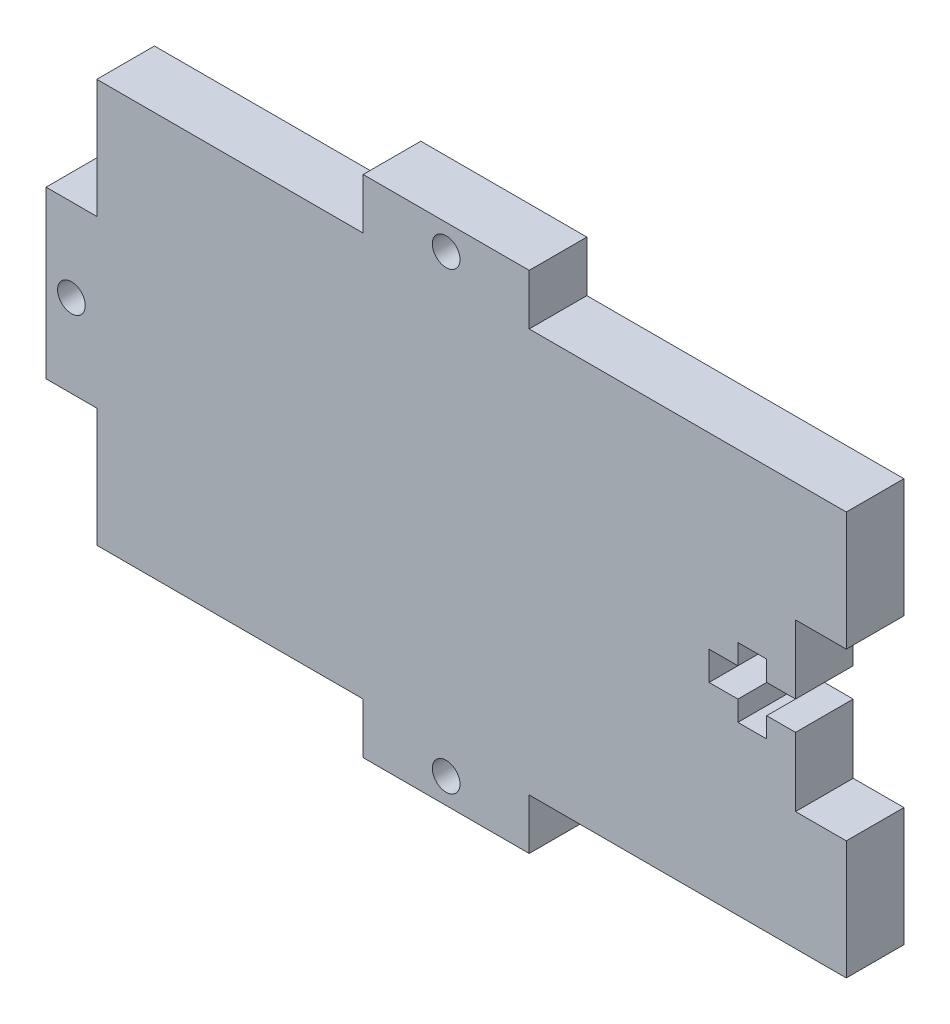
ISO-10303-21;
HEADER;
FILE_DESCRIPTION(('STEP AP214'),'2;1');
FILE_NAME('part.step','',(''),(''),'','','');
FILE_SCHEMA(('AUTOMOTIVE_DESIGN { 1 0 10303 214 1 1 1 1 }'));
ENDSEC;
DATA;
#1=APPLICATION_CONTEXT('core data for automotive mechanical design processes');
#2=APPLICATION_PROTOCOL_DEFINITION('international standard','automotive_design',2000,#1);
#3=PRODUCT_CONTEXT('',#1,'mechanical');
#4=PRODUCT('Part','Part','',(#3));
#5=PRODUCT_RELATED_PRODUCT_CATEGORY('part','',(#4));
#6=PRODUCT_DEFINITION_FORMATION('','',#4);
#7=PRODUCT_DEFINITION_CONTEXT('part definition',#1,'design');
#8=PRODUCT_DEFINITION('design','',#6,#7);
#9=PRODUCT_DEFINITION_SHAPE('','',#8);
#10=(LENGTH_UNIT() NAMED_UNIT(*) SI_UNIT(.MILLI.,.METRE.));
#11=(NAMED_UNIT(*) PLANE_ANGLE_UNIT() SI_UNIT($,.RADIAN.));
#12=(NAMED_UNIT(*) SI_UNIT($,.STERADIAN.) SOLID_ANGLE_UNIT());
#13=UNCERTAINTY_MEASURE_WITH_UNIT(LENGTH_MEASURE(1.E-05),#10,'distance_accuracy_value','');
#14=(GEOMETRIC_REPRESENTATION_CONTEXT(3) GLOBAL_UNCERTAINTY_ASSIGNED_CONTEXT((#13)) GLOBAL_UNIT_ASSIGNED_CONTEXT((#10,
#11,#12)) REPRESENTATION_CONTEXT('',''));
#15=CARTESIAN_POINT('',(0.,0.,0.));
#16=DIRECTION('',(0.,0.,1.));
#17=DIRECTION('',(1.,0.,0.));
#18=AXIS2_PLACEMENT_3D('',#15,#16,#17);
#19=CARTESIAN_POINT('',(76.962,13.081,-4.99999999997031E-05));
#20=DIRECTION('',(-1.,0.,0.));
#21=DIRECTION('',(0.,0.,1.));
#22=AXIS2_PLACEMENT_3D('',#19,#20,#21);
#23=PLANE('',#22);
#24=DIRECTION('',(0.,1.,0.));
#25=VECTOR('',#24,1.);
#26=CARTESIAN_POINT('',(76.962,0.,0.));
#27=LINE('',#26,#25);
#28=CARTESIAN_POINT('',(76.962,13.081,0.));
#29=VERTEX_POINT('',#28);
#30=CARTESIAN_POINT('',(76.962,20.6375,0.));
#31=VERTEX_POINT('',#30);
#32=EDGE_CURVE('E262',#29,#31,#27,.T.);
#33=ORIENTED_EDGE('',*,*,#32,.T.);
#34=DIRECTION('',(0.,0.,1.));
#35=VECTOR('',#34,1.);
#36=CARTESIAN_POINT('',(76.962,20.6375,-4.99999999997031E-05));
#37=LINE('',#36,#35);
#38=CARTESIAN_POINT('',(76.962,20.6375,6.35));
#39=VERTEX_POINT('',#38);
#40=EDGE_CURVE('E245',#31,#39,#37,.T.);
#41=ORIENTED_EDGE('',*,*,#40,.T.);
#42=DIRECTION('',(0.,-1.,0.));
#43=VECTOR('',#42,1.);
#44=CARTESIAN_POINT('',(76.962,13.081,6.35));
#45=LINE('',#44,#43);
#46=CARTESIAN_POINT('',(76.962,13.081,6.35));
#47=VERTEX_POINT('',#46);
#48=EDGE_CURVE('E259',#39,#47,#45,.T.);
#49=ORIENTED_EDGE('',*,*,#48,.T.);
#50=DIRECTION('',(0.,0.,1.));
#51=VECTOR('',#50,1.);
#52=CARTESIAN_POINT('',(76.962,13.081,-4.99999999997031E-05));
#53=LINE('',#52,#51);
#54=EDGE_CURVE('E285',#29,#47,#53,.T.);
#55=ORIENTED_EDGE('',*,*,#54,.F.);
#56=EDGE_LOOP('',(#33,#41,#49,#55));
#57=FACE_BOUND('',#56,.T.);
#58=ADVANCED_FACE('F32',(#57),#23,.F.);
#59=CARTESIAN_POINT('',(82.55,0.,6.35));
#60=DIRECTION('',(-1.,0.,0.));
#61=DIRECTION('',(0.,-1.,0.));
#62=AXIS2_PLACEMENT_3D('',#59,#60,#61);
#63=PLANE('',#62);
#64=DIRECTION('',(0.,1.,0.));
#65=VECTOR('',#64,1.);
#66=CARTESIAN_POINT('',(82.55,0.,0.));
#67=LINE('',#66,#65);
#68=CARTESIAN_POINT('',(82.55,0.,0.));
#69=VERTEX_POINT('',#68);
#70=CARTESIAN_POINT('',(82.55,13.081,0.));
#71=VERTEX_POINT('',#70);
#72=EDGE_CURVE('E492',#69,#71,#67,.T.);
#73=ORIENTED_EDGE('',*,*,#72,.T.);
#74=DIRECTION('',(0.,0.,1.));
#75=VECTOR('',#74,1.);
#76=CARTESIAN_POINT('',(82.55,13.081,-4.99999999997031E-05));
#77=LINE('',#76,#75);
#78=CARTESIAN_POINT('',(82.55,13.081,6.35));
#79=VERTEX_POINT('',#78);
#80=EDGE_CURVE('E281',#71,#79,#77,.T.);
#81=ORIENTED_EDGE('',*,*,#80,.T.);
#82=DIRECTION('',(0.,1.,0.));
#83=VECTOR('',#82,1.);
#84=CARTESIAN_POINT('',(82.55,0.,6.35));
#85=LINE('',#84,#83);
#86=CARTESIAN_POINT('',(82.55,0.,6.35));
#87=VERTEX_POINT('',#86);
#88=EDGE_CURVE('E466',#87,#79,#85,.T.);
#89=ORIENTED_EDGE('',*,*,#88,.F.);
#90=DIRECTION('',(0.,0.,-1.));
#91=VECTOR('',#90,1.);
#92=CARTESIAN_POINT('',(82.55,0.,6.35));
#93=LINE('',#92,#91);
#94=EDGE_CURVE('E501',#87,#69,#93,.T.);
#95=ORIENTED_EDGE('',*,*,#94,.T.);
#96=EDGE_LOOP('',(#73,#81,#89,#95));
#97=FACE_BOUND('',#96,.T.);
#98=ADVANCED_FACE('F682',(#97),#63,.F.);
#99=CARTESIAN_POINT('',(0.,0.,6.35));
#100=DIRECTION('',(0.,1.,0.));
#101=DIRECTION('',(0.,0.,1.));
#102=AXIS2_PLACEMENT_3D('',#99,#100,#101);
#103=PLANE('',#102);
#104=DIRECTION('',(0.,0.,1.));
#105=VECTOR('',#104,1.);
#106=CARTESIAN_POINT('',(47.625,0.,0.));
#107=LINE('',#106,#105);
#108=CARTESIAN_POINT('',(47.625,0.,0.));
#109=VERTEX_POINT('',#108);
#110=CARTESIAN_POINT('',(47.625,0.,6.35));
#111=VERTEX_POINT('',#110);
#112=EDGE_CURVE('E304',#109,#111,#107,.T.);
#113=ORIENTED_EDGE('',*,*,#112,.F.);
#114=DIRECTION('',(1.,0.,0.));
#115=VECTOR('',#114,1.);
#116=CARTESIAN_POINT('',(0.,0.,0.));
#117=LINE('',#116,#115);
#118=EDGE_CURVE('E509',#109,#69,#117,.T.);
#119=ORIENTED_EDGE('',*,*,#118,.T.);
#120=ORIENTED_EDGE('',*,*,#94,.F.);
#121=DIRECTION('',(1.,0.,0.));
#122=VECTOR('',#121,1.);
#123=CARTESIAN_POINT('',(0.,0.,6.35));
#124=LINE('',#123,#122);
#125=EDGE_CURVE('E471',#111,#87,#124,.T.);
#126=ORIENTED_EDGE('',*,*,#125,.F.);
#127=EDGE_LOOP('',(#113,#119,#120,#126));
#128=FACE_BOUND('',#127,.T.);
#129=ADVANCED_FACE('F662',(#128),#103,.F.);
#130=CARTESIAN_POINT('',(0.,44.45,6.35));
#131=DIRECTION('',(0.,-1.,0.));
#132=DIRECTION('',(0.,0.,-1.));
#133=AXIS2_PLACEMENT_3D('',#130,#131,#132);
#134=PLANE('',#133);
#135=DIRECTION('',(0.,0.,1.));
#136=VECTOR('',#135,1.);
#137=CARTESIAN_POINT('',(29.337,44.45,0.));
#138=LINE('',#137,#136);
#139=CARTESIAN_POINT('',(29.337,44.45,0.));
#140=VERTEX_POINT('',#139);
#141=CARTESIAN_POINT('',(29.337,44.45,6.35));
#142=VERTEX_POINT('',#141);
#143=EDGE_CURVE('E581',#140,#142,#138,.T.);
#144=ORIENTED_EDGE('',*,*,#143,.F.);
#145=DIRECTION('',(-1.,0.,0.));
#146=VECTOR('',#145,1.);
#147=CARTESIAN_POINT('',(0.,44.45,0.));
#148=LINE('',#147,#146);
#149=CARTESIAN_POINT('',(0.,44.45,0.));
#150=VERTEX_POINT('',#149);
#151=EDGE_CURVE('E488',#140,#150,#148,.T.);
#152=ORIENTED_EDGE('',*,*,#151,.T.);
#153=DIRECTION('',(0.,0.,-1.));
#154=VECTOR('',#153,1.);
#155=CARTESIAN_POINT('',(0.,44.45,6.35));
#156=LINE('',#155,#154);
#157=CARTESIAN_POINT('',(0.,44.45,6.35));
#158=VERTEX_POINT('',#157);
#159=EDGE_CURVE('E487',#158,#150,#156,.T.);
#160=ORIENTED_EDGE('',*,*,#159,.F.);
#161=DIRECTION('',(-1.,0.,0.));
#162=VECTOR('',#161,1.);
#163=CARTESIAN_POINT('',(0.,44.45,6.35));
#164=LINE('',#163,#162);
#165=EDGE_CURVE('E469',#142,#158,#164,.T.);
#166=ORIENTED_EDGE('',*,*,#165,.F.);
#167=EDGE_LOOP('',(#144,#152,#160,#166));
#168=FACE_BOUND('',#167,.T.);
#169=ADVANCED_FACE('F628',(#168),#134,.F.);
#170=CARTESIAN_POINT('',(0.,0.,6.35));
#171=DIRECTION('',(1.,0.,0.));
#172=DIRECTION('',(0.,1.,0.));
#173=AXIS2_PLACEMENT_3D('',#170,#171,#172);
#174=PLANE('',#173);
#175=DIRECTION('',(0.,0.,1.));
#176=VECTOR('',#175,1.);
#177=CARTESIAN_POINT('',(0.,13.081,0.));
#178=LINE('',#177,#176);
#179=CARTESIAN_POINT('',(0.,13.081,0.));
#180=VERTEX_POINT('',#179);
#181=CARTESIAN_POINT('',(0.,13.081,6.35));
#182=VERTEX_POINT('',#181);
#183=EDGE_CURVE('E512',#180,#182,#178,.T.);
#184=ORIENTED_EDGE('',*,*,#183,.F.);
#185=DIRECTION('',(0.,-1.,0.));
#186=VECTOR('',#185,1.);
#187=CARTESIAN_POINT('',(0.,0.,0.));
#188=LINE('',#187,#186);
#189=CARTESIAN_POINT('',(0.,0.,0.));
#190=VERTEX_POINT('',#189);
#191=EDGE_CURVE('E510',#180,#190,#188,.T.);
#192=ORIENTED_EDGE('',*,*,#191,.T.);
#193=DIRECTION('',(0.,0.,-1.));
#194=VECTOR('',#193,1.);
#195=CARTESIAN_POINT('',(0.,0.,6.35));
#196=LINE('',#195,#194);
#197=CARTESIAN_POINT('',(0.,0.,6.35));
#198=VERTEX_POINT('',#197);
#199=EDGE_CURVE('E320',#198,#190,#196,.T.);
#200=ORIENTED_EDGE('',*,*,#199,.F.);
#201=DIRECTION('',(0.,-1.,0.));
#202=VECTOR('',#201,1.);
#203=CARTESIAN_POINT('',(0.,0.,6.35));
#204=LINE('',#203,#202);
#205=EDGE_CURVE('E516',#182,#198,#204,.T.);
#206=ORIENTED_EDGE('',*,*,#205,.F.);
#207=EDGE_LOOP('',(#184,#192,#200,#206));
#208=FACE_BOUND('',#207,.T.);
#209=ADVANCED_FACE('F643',(#208),#174,.F.);
#210=CARTESIAN_POINT('',(0.,31.369,0.));
#211=VERTEX_POINT('',#210);
#212=EDGE_CURVE('E506',#150,#211,#188,.T.);
#213=ORIENTED_EDGE('',*,*,#212,.T.);
#214=DIRECTION('',(0.,0.,1.));
#215=VECTOR('',#214,1.);
#216=CARTESIAN_POINT('',(0.,31.369,0.));
#217=LINE('',#216,#215);
#218=CARTESIAN_POINT('',(0.,31.369,6.35));
#219=VERTEX_POINT('',#218);
#220=EDGE_CURVE('E526',#211,#219,#217,.T.);
#221=ORIENTED_EDGE('',*,*,#220,.T.);
#222=EDGE_CURVE('E513',#158,#219,#204,.T.);
#223=ORIENTED_EDGE('',*,*,#222,.F.);
#224=ORIENTED_EDGE('',*,*,#159,.T.);
#225=EDGE_LOOP('',(#213,#221,#223,#224));
#226=FACE_BOUND('',#225,.T.);
#227=ADVANCED_FACE('F34',(#226),#174,.F.);
#228=CARTESIAN_POINT('',(29.3369999999999,0.,0.));
#229=VERTEX_POINT('',#228);
#230=EDGE_CURVE('E599',#190,#229,#117,.T.);
#231=ORIENTED_EDGE('',*,*,#230,.T.);
#232=DIRECTION('',(0.,0.,1.));
#233=VECTOR('',#232,1.);
#234=CARTESIAN_POINT('',(29.3369999999999,0.,0.));
#235=LINE('',#234,#233);
#236=CARTESIAN_POINT('',(29.3369999999999,0.,6.35));
#237=VERTEX_POINT('',#236);
#238=EDGE_CURVE('E311',#229,#237,#235,.T.);
#239=ORIENTED_EDGE('',*,*,#238,.T.);
#240=EDGE_CURVE('E467',#198,#237,#124,.T.);
#241=ORIENTED_EDGE('',*,*,#240,.F.);
#242=ORIENTED_EDGE('',*,*,#199,.T.);
#243=EDGE_LOOP('',(#231,#239,#241,#242));
#244=FACE_BOUND('',#243,.T.);
#245=ADVANCED_FACE('F642',(#244),#103,.F.);
#246=CARTESIAN_POINT('',(82.55,31.369,6.35));
#247=VERTEX_POINT('',#246);
#248=CARTESIAN_POINT('',(82.55,44.45,6.35));
#249=VERTEX_POINT('',#248);
#250=EDGE_CURVE('E458',#247,#249,#85,.T.);
#251=ORIENTED_EDGE('',*,*,#250,.F.);
#252=DIRECTION('',(0.,0.,1.));
#253=VECTOR('',#252,1.);
#254=CARTESIAN_POINT('',(82.55,31.369,-4.99999999997031E-05));
#255=LINE('',#254,#253);
#256=CARTESIAN_POINT('',(82.55,31.369,0.));
#257=VERTEX_POINT('',#256);
#258=EDGE_CURVE('E280',#257,#247,#255,.T.);
#259=ORIENTED_EDGE('',*,*,#258,.F.);
#260=CARTESIAN_POINT('',(82.55,44.45,0.));
#261=VERTEX_POINT('',#260);
#262=EDGE_CURVE('E602',#257,#261,#67,.T.);
#263=ORIENTED_EDGE('',*,*,#262,.T.);
#264=DIRECTION('',(0.,0.,-1.));
#265=VECTOR('',#264,1.);
#266=CARTESIAN_POINT('',(82.55,44.45,6.35));
#267=LINE('',#266,#265);
#268=EDGE_CURVE('E464',#249,#261,#267,.T.);
#269=ORIENTED_EDGE('',*,*,#268,.F.);
#270=EDGE_LOOP('',(#251,#259,#263,#269));
#271=FACE_BOUND('',#270,.T.);
#272=ADVANCED_FACE('F461',(#271),#63,.F.);
#273=CARTESIAN_POINT('',(47.625,44.45,0.));
#274=VERTEX_POINT('',#273);
#275=EDGE_CURVE('E491',#261,#274,#148,.T.);
#276=ORIENTED_EDGE('',*,*,#275,.T.);
#277=DIRECTION('',(0.,0.,1.));
#278=VECTOR('',#277,1.);
#279=CARTESIAN_POINT('',(47.625,44.45,0.));
#280=LINE('',#279,#278);
#281=CARTESIAN_POINT('',(47.625,44.45,6.35));
#282=VERTEX_POINT('',#281);
#283=EDGE_CURVE('E568',#274,#282,#280,.T.);
#284=ORIENTED_EDGE('',*,*,#283,.T.);
#285=EDGE_CURVE('E485',#249,#282,#164,.T.);
#286=ORIENTED_EDGE('',*,*,#285,.F.);
#287=ORIENTED_EDGE('',*,*,#268,.T.);
#288=EDGE_LOOP('',(#276,#284,#286,#287));
#289=FACE_BOUND('',#288,.T.);
#290=ADVANCED_FACE('F635',(#289),#134,.F.);
#291=CARTESIAN_POINT('',(0.,0.,6.35));
#292=DIRECTION('',(0.,0.,-1.));
#293=DIRECTION('',(-1.,0.,0.));
#294=AXIS2_PLACEMENT_3D('',#291,#292,#293);
#295=PLANE('',#294);
#296=CARTESIAN_POINT('',(38.481,47.244,6.35));
#297=DIRECTION('',(0.,0.,1.));
#298=DIRECTION('',(1.,0.,0.));
#299=AXIS2_PLACEMENT_3D('',#296,#297,#298);
#300=CIRCLE('',#299,1.524);
#301=CARTESIAN_POINT('',(40.005,47.244,6.35));
#302=VERTEX_POINT('',#301);
#303=EDGE_CURVE('E353',#302,#302,#300,.T.);
#304=ORIENTED_EDGE('',*,*,#303,.F.);
#305=EDGE_LOOP('',(#304));
#306=FACE_BOUND('',#305,.T.);
#307=CARTESIAN_POINT('',(38.481,-2.79399999999999,6.35));
#308=DIRECTION('',(0.,0.,1.));
#309=DIRECTION('',(1.,0.,0.));
#310=AXIS2_PLACEMENT_3D('',#307,#308,#309);
#311=CIRCLE('',#310,1.524);
#312=CARTESIAN_POINT('',(40.005,-2.79399999999999,6.35));
#313=VERTEX_POINT('',#312);
#314=EDGE_CURVE('E343',#313,#313,#311,.T.);
#315=ORIENTED_EDGE('',*,*,#314,.F.);
#316=EDGE_LOOP('',(#315));
#317=FACE_BOUND('',#316,.T.);
#318=CARTESIAN_POINT('',(-2.794,22.225,6.35));
#319=DIRECTION('',(0.,0.,1.));
#320=DIRECTION('',(1.,0.,0.));
#321=AXIS2_PLACEMENT_3D('',#318,#319,#320);
#322=CIRCLE('',#321,1.524);
#323=CARTESIAN_POINT('',(-1.27,22.225,6.35));
#324=VERTEX_POINT('',#323);
#325=EDGE_CURVE('E340',#324,#324,#322,.T.);
#326=ORIENTED_EDGE('',*,*,#325,.F.);
#327=EDGE_LOOP('',(#326));
#328=FACE_BOUND('',#327,.T.);
#329=ORIENTED_EDGE('',*,*,#48,.F.);
#330=DIRECTION('',(1.,0.,0.));
#331=VECTOR('',#330,1.);
#332=CARTESIAN_POINT('',(73.787,20.6375,6.35));
#333=LINE('',#332,#331);
#334=CARTESIAN_POINT('',(73.787,20.6375,6.35));
#335=VERTEX_POINT('',#334);
#336=EDGE_CURVE('E242',#335,#39,#333,.T.);
#337=ORIENTED_EDGE('',*,*,#336,.F.);
#338=DIRECTION('',(0.,1.,0.));
#339=VECTOR('',#338,1.);
#340=CARTESIAN_POINT('',(73.787,18.415,6.35));
#341=LINE('',#340,#339);
#342=CARTESIAN_POINT('',(73.787,18.415,6.35));
#343=VERTEX_POINT('',#342);
#344=EDGE_CURVE('E382',#343,#335,#341,.T.);
#345=ORIENTED_EDGE('',*,*,#344,.F.);
#346=DIRECTION('',(1.,0.,0.));
#347=VECTOR('',#346,1.);
#348=CARTESIAN_POINT('',(70.612,18.415,6.35));
#349=LINE('',#348,#347);
#350=CARTESIAN_POINT('',(70.612,18.415,6.35));
#351=VERTEX_POINT('',#350);
#352=EDGE_CURVE('E379',#351,#343,#349,.T.);
#353=ORIENTED_EDGE('',*,*,#352,.F.);
#354=DIRECTION('',(0.,-1.,0.));
#355=VECTOR('',#354,1.);
#356=CARTESIAN_POINT('',(70.612,18.415,6.35));
#357=LINE('',#356,#355);
#358=CARTESIAN_POINT('',(70.612,20.6375,6.35));
#359=VERTEX_POINT('',#358);
#360=EDGE_CURVE('E376',#359,#351,#357,.T.);
#361=ORIENTED_EDGE('',*,*,#360,.F.);
#362=DIRECTION('',(1.,0.,0.));
#363=VECTOR('',#362,1.);
#364=CARTESIAN_POINT('',(67.437,20.6375,6.35));
#365=LINE('',#364,#363);
#366=CARTESIAN_POINT('',(67.437,20.6375,6.35));
#367=VERTEX_POINT('',#366);
#368=EDGE_CURVE('E373',#367,#359,#365,.T.);
#369=ORIENTED_EDGE('',*,*,#368,.F.);
#370=DIRECTION('',(0.,-1.,0.));
#371=VECTOR('',#370,1.);
#372=CARTESIAN_POINT('',(67.437,23.8125,6.35));
#373=LINE('',#372,#371);
#374=CARTESIAN_POINT('',(67.437,23.8125,6.35));
#375=VERTEX_POINT('',#374);
#376=EDGE_CURVE('E370',#375,#367,#373,.T.);
#377=ORIENTED_EDGE('',*,*,#376,.F.);
#378=DIRECTION('',(-1.,0.,0.));
#379=VECTOR('',#378,1.);
#380=CARTESIAN_POINT('',(67.437,23.8125,6.35));
#381=LINE('',#380,#379);
#382=CARTESIAN_POINT('',(70.612,23.8125,6.35));
#383=VERTEX_POINT('',#382);
#384=EDGE_CURVE('E367',#383,#375,#381,.T.);
#385=ORIENTED_EDGE('',*,*,#384,.F.);
#386=DIRECTION('',(0.,-1.,0.));
#387=VECTOR('',#386,1.);
#388=CARTESIAN_POINT('',(70.612,23.8125,6.35));
#389=LINE('',#388,#387);
#390=CARTESIAN_POINT('',(70.612,26.035,6.35));
#391=VERTEX_POINT('',#390);
#392=EDGE_CURVE('E364',#391,#383,#389,.T.);
#393=ORIENTED_EDGE('',*,*,#392,.F.);
#394=DIRECTION('',(-1.,0.,0.));
#395=VECTOR('',#394,1.);
#396=CARTESIAN_POINT('',(70.612,26.035,6.35));
#397=LINE('',#396,#395);
#398=CARTESIAN_POINT('',(73.787,26.035,6.35));
#399=VERTEX_POINT('',#398);
#400=EDGE_CURVE('E361',#399,#391,#397,.T.);
#401=ORIENTED_EDGE('',*,*,#400,.F.);
#402=DIRECTION('',(0.,1.,0.));
#403=VECTOR('',#402,1.);
#404=CARTESIAN_POINT('',(73.787,23.8125,6.35));
#405=LINE('',#404,#403);
#406=CARTESIAN_POINT('',(73.787,23.8125,6.35));
#407=VERTEX_POINT('',#406);
#408=EDGE_CURVE('E358',#407,#399,#405,.T.);
#409=ORIENTED_EDGE('',*,*,#408,.F.);
#410=DIRECTION('',(-1.,0.,0.));
#411=VECTOR('',#410,1.);
#412=CARTESIAN_POINT('',(73.787,23.8125,6.35));
#413=LINE('',#412,#411);
#414=CARTESIAN_POINT('',(76.962,23.8125,6.35));
#415=VERTEX_POINT('',#414);
#416=EDGE_CURVE('E253',#415,#407,#413,.T.);
#417=ORIENTED_EDGE('',*,*,#416,.F.);
#418=CARTESIAN_POINT('',(76.962,31.369,6.35));
#419=VERTEX_POINT('',#418);
#420=EDGE_CURVE('E270',#419,#415,#45,.T.);
#421=ORIENTED_EDGE('',*,*,#420,.F.);
#422=DIRECTION('',(-1.,0.,0.));
#423=VECTOR('',#422,1.);
#424=CARTESIAN_POINT('',(82.55,31.369,6.35));
#425=LINE('',#424,#423);
#426=EDGE_CURVE('E271',#247,#419,#425,.T.);
#427=ORIENTED_EDGE('',*,*,#426,.F.);
#428=ORIENTED_EDGE('',*,*,#250,.T.);
#429=ORIENTED_EDGE('',*,*,#285,.T.);
#430=DIRECTION('',(0.,1.,0.));
#431=VECTOR('',#430,1.);
#432=CARTESIAN_POINT('',(47.625,44.45,6.35));
#433=LINE('',#432,#431);
#434=CARTESIAN_POINT('',(47.625,50.038,6.35));
#435=VERTEX_POINT('',#434);
#436=EDGE_CURVE('E596',#282,#435,#433,.T.);
#437=ORIENTED_EDGE('',*,*,#436,.T.);
#438=DIRECTION('',(-1.,0.,0.));
#439=VECTOR('',#438,1.);
#440=CARTESIAN_POINT('',(29.337,50.038,6.35));
#441=LINE('',#440,#439);
#442=CARTESIAN_POINT('',(29.337,50.038,6.35));
#443=VERTEX_POINT('',#442);
#444=EDGE_CURVE('E571',#435,#443,#441,.T.);
#445=ORIENTED_EDGE('',*,*,#444,.T.);
#446=DIRECTION('',(0.,-1.,0.));
#447=VECTOR('',#446,1.);
#448=CARTESIAN_POINT('',(29.337,44.45,6.35));
#449=LINE('',#448,#447);
#450=EDGE_CURVE('E307',#443,#142,#449,.T.);
#451=ORIENTED_EDGE('',*,*,#450,.T.);
#452=ORIENTED_EDGE('',*,*,#165,.T.);
#453=ORIENTED_EDGE('',*,*,#222,.T.);
#454=DIRECTION('',(-1.,0.,0.));
#455=VECTOR('',#454,1.);
#456=CARTESIAN_POINT('',(0.,31.369,6.35));
#457=LINE('',#456,#455);
#458=CARTESIAN_POINT('',(-5.588,31.369,6.35));
#459=VERTEX_POINT('',#458);
#460=EDGE_CURVE('E554',#219,#459,#457,.T.);
#461=ORIENTED_EDGE('',*,*,#460,.T.);
#462=DIRECTION('',(0.,-1.,0.));
#463=VECTOR('',#462,1.);
#464=CARTESIAN_POINT('',(-5.588,31.369,6.35));
#465=LINE('',#464,#463);
#466=CARTESIAN_POINT('',(-5.588,13.081,6.35));
#467=VERTEX_POINT('',#466);
#468=EDGE_CURVE('E545',#459,#467,#465,.T.);
#469=ORIENTED_EDGE('',*,*,#468,.T.);
#470=DIRECTION('',(1.,0.,0.));
#471=VECTOR('',#470,1.);
#472=CARTESIAN_POINT('',(0.,13.081,6.35));
#473=LINE('',#472,#471);
#474=EDGE_CURVE('E536',#467,#182,#473,.T.);
#475=ORIENTED_EDGE('',*,*,#474,.T.);
#476=ORIENTED_EDGE('',*,*,#205,.T.);
#477=ORIENTED_EDGE('',*,*,#240,.T.);
#478=DIRECTION('',(0.,-1.,0.));
#479=VECTOR('',#478,1.);
#480=CARTESIAN_POINT('',(29.3369999999999,0.,6.35));
#481=LINE('',#480,#479);
#482=CARTESIAN_POINT('',(29.337,-5.588,6.35));
#483=VERTEX_POINT('',#482);
#484=EDGE_CURVE('E284',#237,#483,#481,.T.);
#485=ORIENTED_EDGE('',*,*,#484,.T.);
#486=DIRECTION('',(1.,0.,0.));
#487=VECTOR('',#486,1.);
#488=CARTESIAN_POINT('',(29.337,-5.588,6.35));
#489=LINE('',#488,#487);
#490=CARTESIAN_POINT('',(47.6249999999999,-5.588,6.35));
#491=VERTEX_POINT('',#490);
#492=EDGE_CURVE('E295',#483,#491,#489,.T.);
#493=ORIENTED_EDGE('',*,*,#492,.T.);
#494=DIRECTION('',(0.,1.,0.));
#495=VECTOR('',#494,1.);
#496=CARTESIAN_POINT('',(47.625,0.,6.35));
#497=LINE('',#496,#495);
#498=EDGE_CURVE('E298',#491,#111,#497,.T.);
#499=ORIENTED_EDGE('',*,*,#498,.T.);
#500=ORIENTED_EDGE('',*,*,#125,.T.);
#501=ORIENTED_EDGE('',*,*,#88,.T.);
#502=DIRECTION('',(1.,0.,0.));
#503=VECTOR('',#502,1.);
#504=CARTESIAN_POINT('',(82.55,13.081,6.35));
#505=LINE('',#504,#503);
#506=EDGE_CURVE('E269',#47,#79,#505,.T.);
#507=ORIENTED_EDGE('',*,*,#506,.F.);
#508=EDGE_LOOP('',(#329,#337,#345,#353,#361,#369,#377,#385,#393,#401,#409,#417,#421,#427,#428,
#429,#437,#445,#451,#452,#453,#461,#469,#475,#476,#477,#485,#493,#499,#500,#501,#507));
#509=FACE_BOUND('',#508,.T.);
#510=ADVANCED_FACE('F267',(#306,#317,#328,#509),#295,.F.);
#511=CARTESIAN_POINT('',(0.,0.,0.));
#512=DIRECTION('',(0.,0.,-1.));
#513=DIRECTION('',(-1.,0.,0.));
#514=AXIS2_PLACEMENT_3D('',#511,#512,#513);
#515=PLANE('',#514);
#516=CARTESIAN_POINT('',(38.481,47.244,0.));
#517=DIRECTION('',(0.,0.,-1.));
#518=DIRECTION('',(-1.,0.,0.));
#519=AXIS2_PLACEMENT_3D('',#516,#517,#518);
#520=CIRCLE('',#519,1.524);
#521=CARTESIAN_POINT('',(36.957,47.244,0.));
#522=VERTEX_POINT('',#521);
#523=EDGE_CURVE('E36',#522,#522,#520,.T.);
#524=ORIENTED_EDGE('',*,*,#523,.F.);
#525=EDGE_LOOP('',(#524));
#526=FACE_BOUND('',#525,.T.);
#527=CARTESIAN_POINT('',(38.481,-2.79399999999999,0.));
#528=DIRECTION('',(0.,0.,-1.));
#529=DIRECTION('',(-1.,0.,0.));
#530=AXIS2_PLACEMENT_3D('',#527,#528,#529);
#531=CIRCLE('',#530,1.524);
#532=CARTESIAN_POINT('',(36.957,-2.79399999999999,0.));
#533=VERTEX_POINT('',#532);
#534=EDGE_CURVE('E341',#533,#533,#531,.T.);
#535=ORIENTED_EDGE('',*,*,#534,.F.);
#536=EDGE_LOOP('',(#535));
#537=FACE_BOUND('',#536,.T.);
#538=CARTESIAN_POINT('',(-2.794,22.225,0.));
#539=DIRECTION('',(0.,0.,-1.));
#540=DIRECTION('',(-1.,0.,0.));
#541=AXIS2_PLACEMENT_3D('',#538,#539,#540);
#542=CIRCLE('',#541,1.524);
#543=CARTESIAN_POINT('',(-4.318,22.225,0.));
#544=VERTEX_POINT('',#543);
#545=EDGE_CURVE('E254',#544,#544,#542,.T.);
#546=ORIENTED_EDGE('',*,*,#545,.F.);
#547=EDGE_LOOP('',(#546));
#548=FACE_BOUND('',#547,.T.);
#549=DIRECTION('',(-1.,0.,0.));
#550=VECTOR('',#549,1.);
#551=CARTESIAN_POINT('',(0.,20.6375,0.));
#552=LINE('',#551,#550);
#553=CARTESIAN_POINT('',(73.787,20.6375,0.));
#554=VERTEX_POINT('',#553);
#555=EDGE_CURVE('E275',#31,#554,#552,.T.);
#556=ORIENTED_EDGE('',*,*,#555,.F.);
#557=ORIENTED_EDGE('',*,*,#32,.F.);
#558=DIRECTION('',(-1.,0.,0.));
#559=VECTOR('',#558,1.);
#560=CARTESIAN_POINT('',(0.,13.081,0.));
#561=LINE('',#560,#559);
#562=EDGE_CURVE('E322',#71,#29,#561,.T.);
#563=ORIENTED_EDGE('',*,*,#562,.F.);
#564=ORIENTED_EDGE('',*,*,#72,.F.);
#565=ORIENTED_EDGE('',*,*,#118,.F.);
#566=DIRECTION('',(0.,1.,0.));
#567=VECTOR('',#566,1.);
#568=CARTESIAN_POINT('',(47.625,0.,0.));
#569=LINE('',#568,#567);
#570=CARTESIAN_POINT('',(47.6249999999999,-5.588,0.));
#571=VERTEX_POINT('',#570);
#572=EDGE_CURVE('E293',#571,#109,#569,.T.);
#573=ORIENTED_EDGE('',*,*,#572,.F.);
#574=DIRECTION('',(1.,0.,0.));
#575=VECTOR('',#574,1.);
#576=CARTESIAN_POINT('',(29.337,-5.588,0.));
#577=LINE('',#576,#575);
#578=CARTESIAN_POINT('',(29.337,-5.588,0.));
#579=VERTEX_POINT('',#578);
#580=EDGE_CURVE('E290',#579,#571,#577,.T.);
#581=ORIENTED_EDGE('',*,*,#580,.F.);
#582=DIRECTION('',(0.,-1.,0.));
#583=VECTOR('',#582,1.);
#584=CARTESIAN_POINT('',(29.3369999999999,0.,0.));
#585=LINE('',#584,#583);
#586=EDGE_CURVE('E294',#229,#579,#585,.T.);
#587=ORIENTED_EDGE('',*,*,#586,.F.);
#588=ORIENTED_EDGE('',*,*,#230,.F.);
#589=ORIENTED_EDGE('',*,*,#191,.F.);
#590=DIRECTION('',(1.,0.,0.));
#591=VECTOR('',#590,1.);
#592=CARTESIAN_POINT('',(0.,13.081,0.));
#593=LINE('',#592,#591);
#594=CARTESIAN_POINT('',(-5.588,13.081,0.));
#595=VERTEX_POINT('',#594);
#596=EDGE_CURVE('E530',#595,#180,#593,.T.);
#597=ORIENTED_EDGE('',*,*,#596,.F.);
#598=DIRECTION('',(0.,-1.,0.));
#599=VECTOR('',#598,1.);
#600=CARTESIAN_POINT('',(-5.588,31.369,0.));
#601=LINE('',#600,#599);
#602=CARTESIAN_POINT('',(-5.588,31.369,0.));
#603=VERTEX_POINT('',#602);
#604=EDGE_CURVE('E535',#603,#595,#601,.T.);
#605=ORIENTED_EDGE('',*,*,#604,.F.);
#606=DIRECTION('',(-1.,0.,0.));
#607=VECTOR('',#606,1.);
#608=CARTESIAN_POINT('',(0.,31.369,0.));
#609=LINE('',#608,#607);
#610=EDGE_CURVE('E532',#211,#603,#609,.T.);
#611=ORIENTED_EDGE('',*,*,#610,.F.);
#612=ORIENTED_EDGE('',*,*,#212,.F.);
#613=ORIENTED_EDGE('',*,*,#151,.F.);
#614=DIRECTION('',(0.,-1.,0.));
#615=VECTOR('',#614,1.);
#616=CARTESIAN_POINT('',(29.337,44.45,0.));
#617=LINE('',#616,#615);
#618=CARTESIAN_POINT('',(29.337,50.038,0.));
#619=VERTEX_POINT('',#618);
#620=EDGE_CURVE('E587',#619,#140,#617,.T.);
#621=ORIENTED_EDGE('',*,*,#620,.F.);
#622=DIRECTION('',(-1.,0.,0.));
#623=VECTOR('',#622,1.);
#624=CARTESIAN_POINT('',(29.337,50.038,0.));
#625=LINE('',#624,#623);
#626=CARTESIAN_POINT('',(47.625,50.038,0.));
#627=VERTEX_POINT('',#626);
#628=EDGE_CURVE('E586',#627,#619,#625,.T.);
#629=ORIENTED_EDGE('',*,*,#628,.F.);
#630=DIRECTION('',(0.,1.,0.));
#631=VECTOR('',#630,1.);
#632=CARTESIAN_POINT('',(47.625,44.45,0.));
#633=LINE('',#632,#631);
#634=EDGE_CURVE('E583',#274,#627,#633,.T.);
#635=ORIENTED_EDGE('',*,*,#634,.F.);
#636=ORIENTED_EDGE('',*,*,#275,.F.);
#637=ORIENTED_EDGE('',*,*,#262,.F.);
#638=DIRECTION('',(1.,0.,0.));
#639=VECTOR('',#638,1.);
#640=CARTESIAN_POINT('',(0.,31.369,0.));
#641=LINE('',#640,#639);
#642=CARTESIAN_POINT('',(76.962,31.369,0.));
#643=VERTEX_POINT('',#642);
#644=EDGE_CURVE('E318',#643,#257,#641,.T.);
#645=ORIENTED_EDGE('',*,*,#644,.F.);
#646=CARTESIAN_POINT('',(76.962,23.8125,0.));
#647=VERTEX_POINT('',#646);
#648=EDGE_CURVE('E56',#647,#643,#27,.T.);
#649=ORIENTED_EDGE('',*,*,#648,.F.);
#650=DIRECTION('',(1.,0.,0.));
#651=VECTOR('',#650,1.);
#652=CARTESIAN_POINT('',(0.,23.8125,0.));
#653=LINE('',#652,#651);
#654=CARTESIAN_POINT('',(73.787,23.8125,0.));
#655=VERTEX_POINT('',#654);
#656=EDGE_CURVE('E49',#655,#647,#653,.T.);
#657=ORIENTED_EDGE('',*,*,#656,.F.);
#658=DIRECTION('',(0.,-1.,0.));
#659=VECTOR('',#658,1.);
#660=CARTESIAN_POINT('',(73.787,0.,0.));
#661=LINE('',#660,#659);
#662=CARTESIAN_POINT('',(73.787,26.035,0.));
#663=VERTEX_POINT('',#662);
#664=EDGE_CURVE('E263',#663,#655,#661,.T.);
#665=ORIENTED_EDGE('',*,*,#664,.F.);
#666=DIRECTION('',(1.,0.,0.));
#667=VECTOR('',#666,1.);
#668=CARTESIAN_POINT('',(0.,26.035,0.));
#669=LINE('',#668,#667);
#670=CARTESIAN_POINT('',(70.612,26.035,0.));
#671=VERTEX_POINT('',#670);
#672=EDGE_CURVE('E326',#671,#663,#669,.T.);
#673=ORIENTED_EDGE('',*,*,#672,.F.);
#674=DIRECTION('',(0.,1.,0.));
#675=VECTOR('',#674,1.);
#676=CARTESIAN_POINT('',(70.612,0.,0.));
#677=LINE('',#676,#675);
#678=CARTESIAN_POINT('',(70.612,23.8125,0.));
#679=VERTEX_POINT('',#678);
#680=EDGE_CURVE('E328',#679,#671,#677,.T.);
#681=ORIENTED_EDGE('',*,*,#680,.F.);
#682=DIRECTION('',(1.,0.,0.));
#683=VECTOR('',#682,1.);
#684=CARTESIAN_POINT('',(0.,23.8125,0.));
#685=LINE('',#684,#683);
#686=CARTESIAN_POINT('',(67.437,23.8125,0.));
#687=VERTEX_POINT('',#686);
#688=EDGE_CURVE('E330',#687,#679,#685,.T.);
#689=ORIENTED_EDGE('',*,*,#688,.F.);
#690=DIRECTION('',(0.,1.,0.));
#691=VECTOR('',#690,1.);
#692=CARTESIAN_POINT('',(67.437,0.,0.));
#693=LINE('',#692,#691);
#694=CARTESIAN_POINT('',(67.437,20.6375,0.));
#695=VERTEX_POINT('',#694);
#696=EDGE_CURVE('E332',#695,#687,#693,.T.);
#697=ORIENTED_EDGE('',*,*,#696,.F.);
#698=DIRECTION('',(-1.,0.,0.));
#699=VECTOR('',#698,1.);
#700=CARTESIAN_POINT('',(0.,20.6375000000001,0.));
#701=LINE('',#700,#699);
#702=CARTESIAN_POINT('',(70.612,20.6375,0.));
#703=VERTEX_POINT('',#702);
#704=EDGE_CURVE('E334',#703,#695,#701,.T.);
#705=ORIENTED_EDGE('',*,*,#704,.F.);
#706=DIRECTION('',(0.,1.,0.));
#707=VECTOR('',#706,1.);
#708=CARTESIAN_POINT('',(70.612,0.,0.));
#709=LINE('',#708,#707);
#710=CARTESIAN_POINT('',(70.612,18.415,0.));
#711=VERTEX_POINT('',#710);
#712=EDGE_CURVE('E336',#711,#703,#709,.T.);
#713=ORIENTED_EDGE('',*,*,#712,.F.);
#714=DIRECTION('',(-1.,0.,0.));
#715=VECTOR('',#714,1.);
#716=CARTESIAN_POINT('',(0.,18.415,0.));
#717=LINE('',#716,#715);
#718=CARTESIAN_POINT('',(73.787,18.415,0.));
#719=VERTEX_POINT('',#718);
#720=EDGE_CURVE('E41',#719,#711,#717,.T.);
#721=ORIENTED_EDGE('',*,*,#720,.F.);
#722=DIRECTION('',(0.,-1.,0.));
#723=VECTOR('',#722,1.);
#724=CARTESIAN_POINT('',(73.787,0.,0.));
#725=LINE('',#724,#723);
#726=EDGE_CURVE('E11',#554,#719,#725,.T.);
#727=ORIENTED_EDGE('',*,*,#726,.F.);
#728=EDGE_LOOP('',(#556,#557,#563,#564,#565,#573,#581,#587,#588,#589,#597,#605,#611,#612,#613,
#621,#629,#635,#636,#637,#645,#649,#657,#665,#673,#681,#689,#697,#705,#713,#721,#727));
#729=FACE_BOUND('',#728,.T.);
#730=ADVANCED_FACE('F409',(#526,#537,#548,#729),#515,.T.);
#731=CARTESIAN_POINT('',(0.,13.081,0.));
#732=DIRECTION('',(0.,-1.,0.));
#733=DIRECTION('',(0.,0.,-1.));
#734=AXIS2_PLACEMENT_3D('',#731,#732,#733);
#735=PLANE('',#734);
#736=ORIENTED_EDGE('',*,*,#474,.F.);
#737=DIRECTION('',(0.,0.,1.));
#738=VECTOR('',#737,1.);
#739=CARTESIAN_POINT('',(-5.588,13.081,0.));
#740=LINE('',#739,#738);
#741=EDGE_CURVE('E541',#595,#467,#740,.T.);
#742=ORIENTED_EDGE('',*,*,#741,.F.);
#743=ORIENTED_EDGE('',*,*,#596,.T.);
#744=ORIENTED_EDGE('',*,*,#183,.T.);
#745=EDGE_LOOP('',(#736,#742,#743,#744));
#746=FACE_BOUND('',#745,.T.);
#747=ADVANCED_FACE('F778',(#746),#735,.T.);
#748=CARTESIAN_POINT('',(-5.588,31.369,0.));
#749=DIRECTION('',(-1.,0.,0.));
#750=DIRECTION('',(0.,0.,1.));
#751=AXIS2_PLACEMENT_3D('',#748,#749,#750);
#752=PLANE('',#751);
#753=ORIENTED_EDGE('',*,*,#468,.F.);
#754=DIRECTION('',(0.,0.,1.));
#755=VECTOR('',#754,1.);
#756=CARTESIAN_POINT('',(-5.588,31.369,0.));
#757=LINE('',#756,#755);
#758=EDGE_CURVE('E523',#603,#459,#757,.T.);
#759=ORIENTED_EDGE('',*,*,#758,.F.);
#760=ORIENTED_EDGE('',*,*,#604,.T.);
#761=ORIENTED_EDGE('',*,*,#741,.T.);
#762=EDGE_LOOP('',(#753,#759,#760,#761));
#763=FACE_BOUND('',#762,.T.);
#764=ADVANCED_FACE('F557',(#763),#752,.T.);
#765=CARTESIAN_POINT('',(0.,31.369,0.));
#766=DIRECTION('',(0.,1.,0.));
#767=DIRECTION('',(-1.,0.,0.));
#768=AXIS2_PLACEMENT_3D('',#765,#766,#767);
#769=PLANE('',#768);
#770=ORIENTED_EDGE('',*,*,#460,.F.);
#771=ORIENTED_EDGE('',*,*,#220,.F.);
#772=ORIENTED_EDGE('',*,*,#610,.T.);
#773=ORIENTED_EDGE('',*,*,#758,.T.);
#774=EDGE_LOOP('',(#770,#771,#772,#773));
#775=FACE_BOUND('',#774,.T.);
#776=ADVANCED_FACE('F552',(#775),#769,.T.);
#777=CARTESIAN_POINT('',(29.337,44.45,0.));
#778=DIRECTION('',(-1.,0.,0.));
#779=DIRECTION('',(0.,-1.,0.));
#780=AXIS2_PLACEMENT_3D('',#777,#778,#779);
#781=PLANE('',#780);
#782=ORIENTED_EDGE('',*,*,#450,.F.);
#783=DIRECTION('',(0.,0.,1.));
#784=VECTOR('',#783,1.);
#785=CARTESIAN_POINT('',(29.337,50.038,0.));
#786=LINE('',#785,#784);
#787=EDGE_CURVE('E561',#619,#443,#786,.T.);
#788=ORIENTED_EDGE('',*,*,#787,.F.);
#789=ORIENTED_EDGE('',*,*,#620,.T.);
#790=ORIENTED_EDGE('',*,*,#143,.T.);
#791=EDGE_LOOP('',(#782,#788,#789,#790));
#792=FACE_BOUND('',#791,.T.);
#793=ADVANCED_FACE('F625',(#792),#781,.T.);
#794=CARTESIAN_POINT('',(29.337,50.038,0.));
#795=DIRECTION('',(0.,1.,0.));
#796=DIRECTION('',(0.,0.,1.));
#797=AXIS2_PLACEMENT_3D('',#794,#795,#796);
#798=PLANE('',#797);
#799=ORIENTED_EDGE('',*,*,#444,.F.);
#800=DIRECTION('',(0.,0.,1.));
#801=VECTOR('',#800,1.);
#802=CARTESIAN_POINT('',(47.625,50.038,0.));
#803=LINE('',#802,#801);
#804=EDGE_CURVE('E562',#627,#435,#803,.T.);
#805=ORIENTED_EDGE('',*,*,#804,.F.);
#806=ORIENTED_EDGE('',*,*,#628,.T.);
#807=ORIENTED_EDGE('',*,*,#787,.T.);
#808=EDGE_LOOP('',(#799,#805,#806,#807));
#809=FACE_BOUND('',#808,.T.);
#810=ADVANCED_FACE('F616',(#809),#798,.T.);
#811=CARTESIAN_POINT('',(47.625,44.45,0.));
#812=DIRECTION('',(1.,0.,0.));
#813=DIRECTION('',(0.,1.,0.));
#814=AXIS2_PLACEMENT_3D('',#811,#812,#813);
#815=PLANE('',#814);
#816=ORIENTED_EDGE('',*,*,#436,.F.);
#817=ORIENTED_EDGE('',*,*,#283,.F.);
#818=ORIENTED_EDGE('',*,*,#634,.T.);
#819=ORIENTED_EDGE('',*,*,#804,.T.);
#820=EDGE_LOOP('',(#816,#817,#818,#819));
#821=FACE_BOUND('',#820,.T.);
#822=ADVANCED_FACE('F633',(#821),#815,.T.);
#823=CARTESIAN_POINT('',(47.625,0.,0.));
#824=DIRECTION('',(1.,0.,0.));
#825=DIRECTION('',(0.,1.,0.));
#826=AXIS2_PLACEMENT_3D('',#823,#824,#825);
#827=PLANE('',#826);
#828=ORIENTED_EDGE('',*,*,#498,.F.);
#829=DIRECTION('',(0.,0.,1.));
#830=VECTOR('',#829,1.);
#831=CARTESIAN_POINT('',(47.6249999999999,-5.588,0.));
#832=LINE('',#831,#830);
#833=EDGE_CURVE('E301',#571,#491,#832,.T.);
#834=ORIENTED_EDGE('',*,*,#833,.F.);
#835=ORIENTED_EDGE('',*,*,#572,.T.);
#836=ORIENTED_EDGE('',*,*,#112,.T.);
#837=EDGE_LOOP('',(#828,#834,#835,#836));
#838=FACE_BOUND('',#837,.T.);
#839=ADVANCED_FACE('F658',(#838),#827,.T.);
#840=CARTESIAN_POINT('',(29.337,-5.588,0.));
#841=DIRECTION('',(0.,-1.,0.));
#842=DIRECTION('',(0.,0.,-1.));
#843=AXIS2_PLACEMENT_3D('',#840,#841,#842);
#844=PLANE('',#843);
#845=ORIENTED_EDGE('',*,*,#492,.F.);
#846=DIRECTION('',(0.,0.,1.));
#847=VECTOR('',#846,1.);
#848=CARTESIAN_POINT('',(29.337,-5.588,0.));
#849=LINE('',#848,#847);
#850=EDGE_CURVE('E613',#579,#483,#849,.T.);
#851=ORIENTED_EDGE('',*,*,#850,.F.);
#852=ORIENTED_EDGE('',*,*,#580,.T.);
#853=ORIENTED_EDGE('',*,*,#833,.T.);
#854=EDGE_LOOP('',(#845,#851,#852,#853));
#855=FACE_BOUND('',#854,.T.);
#856=ADVANCED_FACE('F700',(#855),#844,.T.);
#857=CARTESIAN_POINT('',(29.3369999999999,0.,0.));
#858=DIRECTION('',(-1.,0.,0.));
#859=DIRECTION('',(0.,-1.,0.));
#860=AXIS2_PLACEMENT_3D('',#857,#858,#859);
#861=PLANE('',#860);
#862=ORIENTED_EDGE('',*,*,#484,.F.);
#863=ORIENTED_EDGE('',*,*,#238,.F.);
#864=ORIENTED_EDGE('',*,*,#586,.T.);
#865=ORIENTED_EDGE('',*,*,#850,.T.);
#866=EDGE_LOOP('',(#862,#863,#864,#865));
#867=FACE_BOUND('',#866,.T.);
#868=ADVANCED_FACE('F652',(#867),#861,.T.);
#869=CARTESIAN_POINT('',(82.55,13.081,-4.99999999997031E-05));
#870=DIRECTION('',(0.,-1.,0.));
#871=DIRECTION('',(0.,0.,-1.));
#872=AXIS2_PLACEMENT_3D('',#869,#870,#871);
#873=PLANE('',#872);
#874=ORIENTED_EDGE('',*,*,#562,.T.);
#875=ORIENTED_EDGE('',*,*,#54,.T.);
#876=ORIENTED_EDGE('',*,*,#506,.T.);
#877=ORIENTED_EDGE('',*,*,#80,.F.);
#878=EDGE_LOOP('',(#874,#875,#876,#877));
#879=FACE_BOUND('',#878,.T.);
#880=ADVANCED_FACE('F691',(#879),#873,.F.);
#881=ORIENTED_EDGE('',*,*,#420,.T.);
#882=DIRECTION('',(0.,0.,-1.));
#883=VECTOR('',#882,1.);
#884=CARTESIAN_POINT('',(76.962,23.8125,-4.99999999997031E-05));
#885=LINE('',#884,#883);
#886=EDGE_CURVE('E264',#415,#647,#885,.T.);
#887=ORIENTED_EDGE('',*,*,#886,.T.);
#888=ORIENTED_EDGE('',*,*,#648,.T.);
#889=DIRECTION('',(0.,0.,1.));
#890=VECTOR('',#889,1.);
#891=CARTESIAN_POINT('',(76.962,31.369,-4.99999999997031E-05));
#892=LINE('',#891,#890);
#893=EDGE_CURVE('E287',#643,#419,#892,.T.);
#894=ORIENTED_EDGE('',*,*,#893,.T.);
#895=EDGE_LOOP('',(#881,#887,#888,#894));
#896=FACE_BOUND('',#895,.T.);
#897=ADVANCED_FACE('F451',(#896),#23,.F.);
#898=CARTESIAN_POINT('',(82.55,31.369,-4.99999999997031E-05));
#899=DIRECTION('',(0.,1.,0.));
#900=DIRECTION('',(0.,0.,1.));
#901=AXIS2_PLACEMENT_3D('',#898,#899,#900);
#902=PLANE('',#901);
#903=ORIENTED_EDGE('',*,*,#644,.T.);
#904=ORIENTED_EDGE('',*,*,#258,.T.);
#905=ORIENTED_EDGE('',*,*,#426,.T.);
#906=ORIENTED_EDGE('',*,*,#893,.F.);
#907=EDGE_LOOP('',(#903,#904,#905,#906));
#908=FACE_BOUND('',#907,.T.);
#909=ADVANCED_FACE('F454',(#908),#902,.F.);
#910=CARTESIAN_POINT('',(73.787,20.6375,-4.99999999997031E-05));
#911=DIRECTION('',(0.,-1.,0.));
#912=DIRECTION('',(0.,0.,-1.));
#913=AXIS2_PLACEMENT_3D('',#910,#911,#912);
#914=PLANE('',#913);
#915=ORIENTED_EDGE('',*,*,#555,.T.);
#916=DIRECTION('',(0.,0.,1.));
#917=VECTOR('',#916,1.);
#918=CARTESIAN_POINT('',(73.787,20.6375,-4.99999999997031E-05));
#919=LINE('',#918,#917);
#920=EDGE_CURVE('E248',#554,#335,#919,.T.);
#921=ORIENTED_EDGE('',*,*,#920,.T.);
#922=ORIENTED_EDGE('',*,*,#336,.T.);
#923=ORIENTED_EDGE('',*,*,#40,.F.);
#924=EDGE_LOOP('',(#915,#921,#922,#923));
#925=FACE_BOUND('',#924,.T.);
#926=ADVANCED_FACE('F244',(#925),#914,.F.);
#927=CARTESIAN_POINT('',(73.787,18.415,-4.99999999997031E-05));
#928=DIRECTION('',(1.,0.,0.));
#929=DIRECTION('',(0.,0.,-1.));
#930=AXIS2_PLACEMENT_3D('',#927,#928,#929);
#931=PLANE('',#930);
#932=ORIENTED_EDGE('',*,*,#726,.T.);
#933=DIRECTION('',(0.,0.,1.));
#934=VECTOR('',#933,1.);
#935=CARTESIAN_POINT('',(73.787,18.415,-4.99999999997031E-05));
#936=LINE('',#935,#934);
#937=EDGE_CURVE('E386',#719,#343,#936,.T.);
#938=ORIENTED_EDGE('',*,*,#937,.T.);
#939=ORIENTED_EDGE('',*,*,#344,.T.);
#940=ORIENTED_EDGE('',*,*,#920,.F.);
#941=EDGE_LOOP('',(#932,#938,#939,#940));
#942=FACE_BOUND('',#941,.T.);
#943=ADVANCED_FACE('F406',(#942),#931,.F.);
#944=CARTESIAN_POINT('',(70.612,18.415,-4.99999999997031E-05));
#945=DIRECTION('',(0.,-1.,0.));
#946=DIRECTION('',(0.,0.,-1.));
#947=AXIS2_PLACEMENT_3D('',#944,#945,#946);
#948=PLANE('',#947);
#949=ORIENTED_EDGE('',*,*,#720,.T.);
#950=DIRECTION('',(0.,0.,1.));
#951=VECTOR('',#950,1.);
#952=CARTESIAN_POINT('',(70.612,18.415,-4.99999999997031E-05));
#953=LINE('',#952,#951);
#954=EDGE_CURVE('E388',#711,#351,#953,.T.);
#955=ORIENTED_EDGE('',*,*,#954,.T.);
#956=ORIENTED_EDGE('',*,*,#352,.T.);
#957=ORIENTED_EDGE('',*,*,#937,.F.);
#958=EDGE_LOOP('',(#949,#955,#956,#957));
#959=FACE_BOUND('',#958,.T.);
#960=ADVANCED_FACE('F414',(#959),#948,.F.);
#961=CARTESIAN_POINT('',(70.612,18.415,-4.99999999997031E-05));
#962=DIRECTION('',(-1.,0.,0.));
#963=DIRECTION('',(0.,0.,1.));
#964=AXIS2_PLACEMENT_3D('',#961,#962,#963);
#965=PLANE('',#964);
#966=ORIENTED_EDGE('',*,*,#712,.T.);
#967=DIRECTION('',(0.,0.,1.));
#968=VECTOR('',#967,1.);
#969=CARTESIAN_POINT('',(70.612,20.6375,-4.99999999997031E-05));
#970=LINE('',#969,#968);
#971=EDGE_CURVE('E390',#703,#359,#970,.T.);
#972=ORIENTED_EDGE('',*,*,#971,.T.);
#973=ORIENTED_EDGE('',*,*,#360,.T.);
#974=ORIENTED_EDGE('',*,*,#954,.F.);
#975=EDGE_LOOP('',(#966,#972,#973,#974));
#976=FACE_BOUND('',#975,.T.);
#977=ADVANCED_FACE('F416',(#976),#965,.F.);
#978=CARTESIAN_POINT('',(67.437,20.6375,-4.99999999997031E-05));
#979=DIRECTION('',(0.,-1.,0.));
#980=DIRECTION('',(1.,0.,0.));
#981=AXIS2_PLACEMENT_3D('',#978,#979,#980);
#982=PLANE('',#981);
#983=ORIENTED_EDGE('',*,*,#704,.T.);
#984=DIRECTION('',(0.,0.,1.));
#985=VECTOR('',#984,1.);
#986=CARTESIAN_POINT('',(67.437,20.6375,-4.99999999997031E-05));
#987=LINE('',#986,#985);
#988=EDGE_CURVE('E392',#695,#367,#987,.T.);
#989=ORIENTED_EDGE('',*,*,#988,.T.);
#990=ORIENTED_EDGE('',*,*,#368,.T.);
#991=ORIENTED_EDGE('',*,*,#971,.F.);
#992=EDGE_LOOP('',(#983,#989,#990,#991));
#993=FACE_BOUND('',#992,.T.);
#994=ADVANCED_FACE('F424',(#993),#982,.F.);
#995=CARTESIAN_POINT('',(67.437,23.8125,-4.99999999997031E-05));
#996=DIRECTION('',(-1.,0.,0.));
#997=DIRECTION('',(0.,0.,1.));
#998=AXIS2_PLACEMENT_3D('',#995,#996,#997);
#999=PLANE('',#998);
#1000=ORIENTED_EDGE('',*,*,#696,.T.);
#1001=DIRECTION('',(0.,0.,1.));
#1002=VECTOR('',#1001,1.);
#1003=CARTESIAN_POINT('',(67.437,23.8125,-4.99999999997031E-05));
#1004=LINE('',#1003,#1002);
#1005=EDGE_CURVE('E394',#687,#375,#1004,.T.);
#1006=ORIENTED_EDGE('',*,*,#1005,.T.);
#1007=ORIENTED_EDGE('',*,*,#376,.T.);
#1008=ORIENTED_EDGE('',*,*,#988,.F.);
#1009=EDGE_LOOP('',(#1000,#1006,#1007,#1008));
#1010=FACE_BOUND('',#1009,.T.);
#1011=ADVANCED_FACE('F428',(#1010),#999,.F.);
#1012=CARTESIAN_POINT('',(67.437,23.8125,-4.99999999997031E-05));
#1013=DIRECTION('',(0.,1.,0.));
#1014=DIRECTION('',(0.,0.,1.));
#1015=AXIS2_PLACEMENT_3D('',#1012,#1013,#1014);
#1016=PLANE('',#1015);
#1017=ORIENTED_EDGE('',*,*,#688,.T.);
#1018=DIRECTION('',(0.,0.,1.));
#1019=VECTOR('',#1018,1.);
#1020=CARTESIAN_POINT('',(70.612,23.8125,-4.99999999997031E-05));
#1021=LINE('',#1020,#1019);
#1022=EDGE_CURVE('E396',#679,#383,#1021,.T.);
#1023=ORIENTED_EDGE('',*,*,#1022,.T.);
#1024=ORIENTED_EDGE('',*,*,#384,.T.);
#1025=ORIENTED_EDGE('',*,*,#1005,.F.);
#1026=EDGE_LOOP('',(#1017,#1023,#1024,#1025));
#1027=FACE_BOUND('',#1026,.T.);
#1028=ADVANCED_FACE('F432',(#1027),#1016,.F.);
#1029=CARTESIAN_POINT('',(70.612,23.8125,-4.99999999997031E-05));
#1030=DIRECTION('',(-1.,0.,0.));
#1031=DIRECTION('',(0.,0.,1.));
#1032=AXIS2_PLACEMENT_3D('',#1029,#1030,#1031);
#1033=PLANE('',#1032);
#1034=ORIENTED_EDGE('',*,*,#680,.T.);
#1035=DIRECTION('',(0.,0.,1.));
#1036=VECTOR('',#1035,1.);
#1037=CARTESIAN_POINT('',(70.612,26.035,-4.99999999997031E-05));
#1038=LINE('',#1037,#1036);
#1039=EDGE_CURVE('E398',#671,#391,#1038,.T.);
#1040=ORIENTED_EDGE('',*,*,#1039,.T.);
#1041=ORIENTED_EDGE('',*,*,#392,.T.);
#1042=ORIENTED_EDGE('',*,*,#1022,.F.);
#1043=EDGE_LOOP('',(#1034,#1040,#1041,#1042));
#1044=FACE_BOUND('',#1043,.T.);
#1045=ADVANCED_FACE('F438',(#1044),#1033,.F.);
#1046=CARTESIAN_POINT('',(70.612,26.035,-4.99999999997031E-05));
#1047=DIRECTION('',(0.,1.,0.));
#1048=DIRECTION('',(0.,0.,1.));
#1049=AXIS2_PLACEMENT_3D('',#1046,#1047,#1048);
#1050=PLANE('',#1049);
#1051=ORIENTED_EDGE('',*,*,#672,.T.);
#1052=DIRECTION('',(0.,0.,1.));
#1053=VECTOR('',#1052,1.);
#1054=CARTESIAN_POINT('',(73.787,26.035,-4.99999999997031E-05));
#1055=LINE('',#1054,#1053);
#1056=EDGE_CURVE('E400',#663,#399,#1055,.T.);
#1057=ORIENTED_EDGE('',*,*,#1056,.T.);
#1058=ORIENTED_EDGE('',*,*,#400,.T.);
#1059=ORIENTED_EDGE('',*,*,#1039,.F.);
#1060=EDGE_LOOP('',(#1051,#1057,#1058,#1059));
#1061=FACE_BOUND('',#1060,.T.);
#1062=ADVANCED_FACE('F443',(#1061),#1050,.F.);
#1063=CARTESIAN_POINT('',(73.787,23.8125,-4.99999999997031E-05));
#1064=DIRECTION('',(1.,0.,0.));
#1065=DIRECTION('',(0.,0.,-1.));
#1066=AXIS2_PLACEMENT_3D('',#1063,#1064,#1065);
#1067=PLANE('',#1066);
#1068=ORIENTED_EDGE('',*,*,#664,.T.);
#1069=DIRECTION('',(0.,0.,1.));
#1070=VECTOR('',#1069,1.);
#1071=CARTESIAN_POINT('',(73.787,23.8125,-4.99999999997031E-05));
#1072=LINE('',#1071,#1070);
#1073=EDGE_CURVE('E384',#655,#407,#1072,.T.);
#1074=ORIENTED_EDGE('',*,*,#1073,.T.);
#1075=ORIENTED_EDGE('',*,*,#408,.T.);
#1076=ORIENTED_EDGE('',*,*,#1056,.F.);
#1077=EDGE_LOOP('',(#1068,#1074,#1075,#1076));
#1078=FACE_BOUND('',#1077,.T.);
#1079=ADVANCED_FACE('F447',(#1078),#1067,.F.);
#1080=CARTESIAN_POINT('',(73.787,23.8125,-4.99999999997031E-05));
#1081=DIRECTION('',(0.,1.,0.));
#1082=DIRECTION('',(0.,0.,1.));
#1083=AXIS2_PLACEMENT_3D('',#1080,#1081,#1082);
#1084=PLANE('',#1083);
#1085=ORIENTED_EDGE('',*,*,#656,.T.);
#1086=ORIENTED_EDGE('',*,*,#886,.F.);
#1087=ORIENTED_EDGE('',*,*,#416,.T.);
#1088=ORIENTED_EDGE('',*,*,#1073,.F.);
#1089=EDGE_LOOP('',(#1085,#1086,#1087,#1088));
#1090=FACE_BOUND('',#1089,.T.);
#1091=ADVANCED_FACE('F668',(#1090),#1084,.F.);
#1092=CARTESIAN_POINT('',(-2.794,22.225,-4.99999999997031E-05));
#1093=DIRECTION('',(0.,0.,1.));
#1094=DIRECTION('',(1.,0.,0.));
#1095=AXIS2_PLACEMENT_3D('',#1092,#1093,#1094);
#1096=CYLINDRICAL_SURFACE('',#1095,1.524);
#1097=ORIENTED_EDGE('',*,*,#545,.T.);
#1098=EDGE_LOOP('',(#1097));
#1099=FACE_BOUND('',#1098,.T.);
#1100=ORIENTED_EDGE('',*,*,#325,.T.);
#1101=EDGE_LOOP('',(#1100));
#1102=FACE_BOUND('',#1101,.T.);
#1103=ADVANCED_FACE('F670',(#1099,#1102),#1096,.F.);
#1104=CARTESIAN_POINT('',(38.481,-2.79399999999999,-4.99999999997031E-05));
#1105=DIRECTION('',(0.,0.,1.));
#1106=DIRECTION('',(1.,0.,0.));
#1107=AXIS2_PLACEMENT_3D('',#1104,#1105,#1106);
#1108=CYLINDRICAL_SURFACE('',#1107,1.524);
#1109=ORIENTED_EDGE('',*,*,#534,.T.);
#1110=EDGE_LOOP('',(#1109));
#1111=FACE_BOUND('',#1110,.T.);
#1112=ORIENTED_EDGE('',*,*,#314,.T.);
#1113=EDGE_LOOP('',(#1112));
#1114=FACE_BOUND('',#1113,.T.);
#1115=ADVANCED_FACE('F676',(#1111,#1114),#1108,.F.);
#1116=CARTESIAN_POINT('',(38.481,47.244,-4.99999999997031E-05));
#1117=DIRECTION('',(0.,0.,1.));
#1118=DIRECTION('',(1.,0.,0.));
#1119=AXIS2_PLACEMENT_3D('',#1116,#1117,#1118);
#1120=CYLINDRICAL_SURFACE('',#1119,1.524);
#1121=ORIENTED_EDGE('',*,*,#523,.T.);
#1122=EDGE_LOOP('',(#1121));
#1123=FACE_BOUND('',#1122,.T.);
#1124=ORIENTED_EDGE('',*,*,#303,.T.);
#1125=EDGE_LOOP('',(#1124));
#1126=FACE_BOUND('',#1125,.T.);
#1127=ADVANCED_FACE('F751',(#1123,#1126),#1120,.F.);
#1128=CLOSED_SHELL('',(#58,#98,#129,#169,#209,#227,#245,#272,#290,#510,#730,#747,#764,#776,#793,
#810,#822,#839,#856,#868,#880,#897,#909,#926,#943,#960,#977,#994,#1011,#1028,#1045,#1062,#1079,
#1091,#1103,#1115,#1127));
#1129=MANIFOLD_SOLID_BREP('B2',#1128);
#1130=ADVANCED_BREP_SHAPE_REPRESENTATION('',(#18,#1129),#14);
#1131=SHAPE_DEFINITION_REPRESENTATION(#9,#1130);
ENDSEC;
END-ISO-10303-21;
